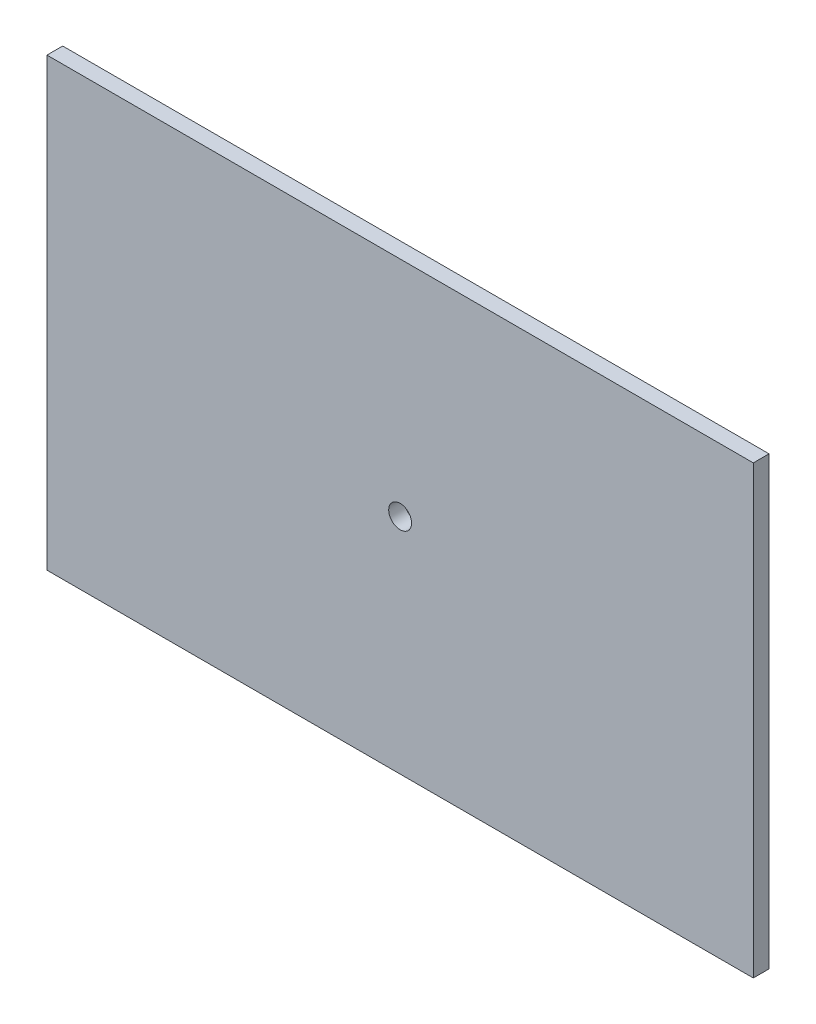
ISO-10303-21;
HEADER;
FILE_DESCRIPTION(('STEP AP214'),'2;1');
FILE_NAME('part.step','',(''),(''),'','','');
FILE_SCHEMA(('AUTOMOTIVE_DESIGN { 1 0 10303 214 1 1 1 1 }'));
ENDSEC;
DATA;
#1=APPLICATION_CONTEXT('core data for automotive mechanical design processes');
#2=APPLICATION_PROTOCOL_DEFINITION('international standard','automotive_design',2000,#1);
#3=PRODUCT_CONTEXT('',#1,'mechanical');
#4=PRODUCT('Part','Part','',(#3));
#5=PRODUCT_RELATED_PRODUCT_CATEGORY('part','',(#4));
#6=PRODUCT_DEFINITION_FORMATION('','',#4);
#7=PRODUCT_DEFINITION_CONTEXT('part definition',#1,'design');
#8=PRODUCT_DEFINITION('design','',#6,#7);
#9=PRODUCT_DEFINITION_SHAPE('','',#8);
#10=(LENGTH_UNIT() NAMED_UNIT(*) SI_UNIT(.MILLI.,.METRE.));
#11=(NAMED_UNIT(*) PLANE_ANGLE_UNIT() SI_UNIT($,.RADIAN.));
#12=(NAMED_UNIT(*) SI_UNIT($,.STERADIAN.) SOLID_ANGLE_UNIT());
#13=UNCERTAINTY_MEASURE_WITH_UNIT(LENGTH_MEASURE(1.E-05),#10,'distance_accuracy_value','');
#14=(GEOMETRIC_REPRESENTATION_CONTEXT(3) GLOBAL_UNCERTAINTY_ASSIGNED_CONTEXT((#13)) GLOBAL_UNIT_ASSIGNED_CONTEXT((#10,
#11,#12)) REPRESENTATION_CONTEXT('',''));
#15=CARTESIAN_POINT('',(0.,0.,0.));
#16=DIRECTION('',(0.,0.,1.));
#17=DIRECTION('',(1.,0.,0.));
#18=AXIS2_PLACEMENT_3D('',#15,#16,#17);
#19=CARTESIAN_POINT('',(0.,0.,17.4625));
#20=DIRECTION('',(1.,0.,0.));
#21=DIRECTION('',(0.,0.,-1.));
#22=AXIS2_PLACEMENT_3D('',#19,#20,#21);
#23=PLANE('',#22);
#24=DIRECTION('',(0.,-1.,0.));
#25=VECTOR('',#24,1.);
#26=CARTESIAN_POINT('',(0.,0.,0.));
#27=LINE('',#26,#25);
#28=CARTESIAN_POINT('',(0.,495.3,0.));
#29=VERTEX_POINT('',#28);
#30=CARTESIAN_POINT('',(0.,0.,0.));
#31=VERTEX_POINT('',#30);
#32=EDGE_CURVE('E96',#29,#31,#27,.T.);
#33=ORIENTED_EDGE('',*,*,#32,.T.);
#34=DIRECTION('',(0.,0.,-1.));
#35=VECTOR('',#34,1.);
#36=CARTESIAN_POINT('',(0.,0.,17.4625));
#37=LINE('',#36,#35);
#38=CARTESIAN_POINT('',(0.,0.,17.4625));
#39=VERTEX_POINT('',#38);
#40=EDGE_CURVE('E11',#39,#31,#37,.T.);
#41=ORIENTED_EDGE('',*,*,#40,.F.);
#42=DIRECTION('',(0.,-1.,0.));
#43=VECTOR('',#42,1.);
#44=CARTESIAN_POINT('',(0.,0.,17.4625));
#45=LINE('',#44,#43);
#46=CARTESIAN_POINT('',(0.,495.3,17.4625));
#47=VERTEX_POINT('',#46);
#48=EDGE_CURVE('E84',#47,#39,#45,.T.);
#49=ORIENTED_EDGE('',*,*,#48,.F.);
#50=DIRECTION('',(0.,0.,-1.));
#51=VECTOR('',#50,1.);
#52=CARTESIAN_POINT('',(0.,495.3,17.4625));
#53=LINE('',#52,#51);
#54=EDGE_CURVE('E92',#47,#29,#53,.T.);
#55=ORIENTED_EDGE('',*,*,#54,.T.);
#56=EDGE_LOOP('',(#33,#41,#49,#55));
#57=FACE_BOUND('',#56,.T.);
#58=ADVANCED_FACE('F33',(#57),#23,.F.);
#59=CARTESIAN_POINT('',(0.,0.,17.4625));
#60=DIRECTION('',(0.,1.,0.));
#61=DIRECTION('',(0.,0.,1.));
#62=AXIS2_PLACEMENT_3D('',#59,#60,#61);
#63=PLANE('',#62);
#64=DIRECTION('',(1.,0.,0.));
#65=VECTOR('',#64,1.);
#66=CARTESIAN_POINT('',(0.,0.,0.));
#67=LINE('',#66,#65);
#68=CARTESIAN_POINT('',(784.225,0.,0.));
#69=VERTEX_POINT('',#68);
#70=EDGE_CURVE('E88',#31,#69,#67,.T.);
#71=ORIENTED_EDGE('',*,*,#70,.T.);
#72=DIRECTION('',(0.,0.,-1.));
#73=VECTOR('',#72,1.);
#74=CARTESIAN_POINT('',(784.225,0.,17.4625));
#75=LINE('',#74,#73);
#76=CARTESIAN_POINT('',(784.225,0.,17.4625));
#77=VERTEX_POINT('',#76);
#78=EDGE_CURVE('E41',#77,#69,#75,.T.);
#79=ORIENTED_EDGE('',*,*,#78,.F.);
#80=DIRECTION('',(1.,0.,0.));
#81=VECTOR('',#80,1.);
#82=CARTESIAN_POINT('',(0.,0.,17.4625));
#83=LINE('',#82,#81);
#84=EDGE_CURVE('E79',#39,#77,#83,.T.);
#85=ORIENTED_EDGE('',*,*,#84,.F.);
#86=ORIENTED_EDGE('',*,*,#40,.T.);
#87=EDGE_LOOP('',(#71,#79,#85,#86));
#88=FACE_BOUND('',#87,.T.);
#89=ADVANCED_FACE('F87',(#88),#63,.F.);
#90=CARTESIAN_POINT('',(784.225,0.,17.4625));
#91=DIRECTION('',(-1.,0.,0.));
#92=DIRECTION('',(0.,0.,1.));
#93=AXIS2_PLACEMENT_3D('',#90,#91,#92);
#94=PLANE('',#93);
#95=DIRECTION('',(0.,1.,0.));
#96=VECTOR('',#95,1.);
#97=CARTESIAN_POINT('',(784.225,0.,0.));
#98=LINE('',#97,#96);
#99=CARTESIAN_POINT('',(784.225,495.3,0.));
#100=VERTEX_POINT('',#99);
#101=EDGE_CURVE('E66',#69,#100,#98,.T.);
#102=ORIENTED_EDGE('',*,*,#101,.T.);
#103=DIRECTION('',(0.,0.,-1.));
#104=VECTOR('',#103,1.);
#105=CARTESIAN_POINT('',(784.225,495.3,17.4625));
#106=LINE('',#105,#104);
#107=CARTESIAN_POINT('',(784.225,495.3,17.4625));
#108=VERTEX_POINT('',#107);
#109=EDGE_CURVE('E89',#108,#100,#106,.T.);
#110=ORIENTED_EDGE('',*,*,#109,.F.);
#111=DIRECTION('',(0.,1.,0.));
#112=VECTOR('',#111,1.);
#113=CARTESIAN_POINT('',(784.225,0.,17.4625));
#114=LINE('',#113,#112);
#115=EDGE_CURVE('E82',#77,#108,#114,.T.);
#116=ORIENTED_EDGE('',*,*,#115,.F.);
#117=ORIENTED_EDGE('',*,*,#78,.T.);
#118=EDGE_LOOP('',(#102,#110,#116,#117));
#119=FACE_BOUND('',#118,.T.);
#120=ADVANCED_FACE('F90',(#119),#94,.F.);
#121=CARTESIAN_POINT('',(0.,495.3,17.4625));
#122=DIRECTION('',(0.,-1.,0.));
#123=DIRECTION('',(0.,0.,-1.));
#124=AXIS2_PLACEMENT_3D('',#121,#122,#123);
#125=PLANE('',#124);
#126=DIRECTION('',(-1.,0.,0.));
#127=VECTOR('',#126,1.);
#128=CARTESIAN_POINT('',(0.,495.3,0.));
#129=LINE('',#128,#127);
#130=EDGE_CURVE('E72',#100,#29,#129,.T.);
#131=ORIENTED_EDGE('',*,*,#130,.T.);
#132=ORIENTED_EDGE('',*,*,#54,.F.);
#133=DIRECTION('',(-1.,0.,0.));
#134=VECTOR('',#133,1.);
#135=CARTESIAN_POINT('',(0.,495.3,17.4625));
#136=LINE('',#135,#134);
#137=EDGE_CURVE('E49',#108,#47,#136,.T.);
#138=ORIENTED_EDGE('',*,*,#137,.F.);
#139=ORIENTED_EDGE('',*,*,#109,.T.);
#140=EDGE_LOOP('',(#131,#132,#138,#139));
#141=FACE_BOUND('',#140,.T.);
#142=ADVANCED_FACE('F104',(#141),#125,.F.);
#143=CARTESIAN_POINT('',(0.,0.,17.4625));
#144=DIRECTION('',(0.,0.,-1.));
#145=DIRECTION('',(-1.,0.,0.));
#146=AXIS2_PLACEMENT_3D('',#143,#144,#145);
#147=PLANE('',#146);
#148=CARTESIAN_POINT('',(392.1125,247.65,17.4625));
#149=DIRECTION('',(0.,0.,1.));
#150=DIRECTION('',(1.,0.,0.));
#151=AXIS2_PLACEMENT_3D('',#148,#149,#150);
#152=CIRCLE('',#151,12.7);
#153=CARTESIAN_POINT('',(404.8125,247.65,17.4625));
#154=VERTEX_POINT('',#153);
#155=EDGE_CURVE('E110',#154,#154,#152,.T.);
#156=ORIENTED_EDGE('',*,*,#155,.F.);
#157=EDGE_LOOP('',(#156));
#158=FACE_BOUND('',#157,.T.);
#159=ORIENTED_EDGE('',*,*,#48,.T.);
#160=ORIENTED_EDGE('',*,*,#84,.T.);
#161=ORIENTED_EDGE('',*,*,#115,.T.);
#162=ORIENTED_EDGE('',*,*,#137,.T.);
#163=EDGE_LOOP('',(#159,#160,#161,#162));
#164=FACE_BOUND('',#163,.T.);
#165=ADVANCED_FACE('F80',(#158,#164),#147,.F.);
#166=CARTESIAN_POINT('',(0.,0.,0.));
#167=DIRECTION('',(0.,0.,-1.));
#168=DIRECTION('',(-1.,0.,0.));
#169=AXIS2_PLACEMENT_3D('',#166,#167,#168);
#170=PLANE('',#169);
#171=CARTESIAN_POINT('',(392.1125,247.65,0.));
#172=DIRECTION('',(0.,0.,1.));
#173=DIRECTION('',(1.,0.,0.));
#174=AXIS2_PLACEMENT_3D('',#171,#172,#173);
#175=CIRCLE('',#174,12.7);
#176=CARTESIAN_POINT('',(404.8125,247.65,0.));
#177=VERTEX_POINT('',#176);
#178=EDGE_CURVE('E99',#177,#177,#175,.T.);
#179=ORIENTED_EDGE('',*,*,#178,.T.);
#180=EDGE_LOOP('',(#179));
#181=FACE_BOUND('',#180,.T.);
#182=ORIENTED_EDGE('',*,*,#32,.F.);
#183=ORIENTED_EDGE('',*,*,#130,.F.);
#184=ORIENTED_EDGE('',*,*,#101,.F.);
#185=ORIENTED_EDGE('',*,*,#70,.F.);
#186=EDGE_LOOP('',(#182,#183,#184,#185));
#187=FACE_BOUND('',#186,.T.);
#188=ADVANCED_FACE('F107',(#181,#187),#170,.T.);
#189=CARTESIAN_POINT('',(392.1125,247.65,0.));
#190=DIRECTION('',(0.,0.,1.));
#191=DIRECTION('',(1.,0.,0.));
#192=AXIS2_PLACEMENT_3D('',#189,#190,#191);
#193=CYLINDRICAL_SURFACE('',#192,12.7);
#194=ORIENTED_EDGE('',*,*,#178,.F.);
#195=EDGE_LOOP('',(#194));
#196=FACE_BOUND('',#195,.T.);
#197=ORIENTED_EDGE('',*,*,#155,.T.);
#198=EDGE_LOOP('',(#197));
#199=FACE_BOUND('',#198,.T.);
#200=ADVANCED_FACE('F117',(#196,#199),#193,.F.);
#201=CLOSED_SHELL('',(#58,#89,#120,#142,#165,#188,#200));
#202=MANIFOLD_SOLID_BREP('B2',#201);
#203=ADVANCED_BREP_SHAPE_REPRESENTATION('',(#18,#202),#14);
#204=SHAPE_DEFINITION_REPRESENTATION(#9,#203);
ENDSEC;
END-ISO-10303-21;
